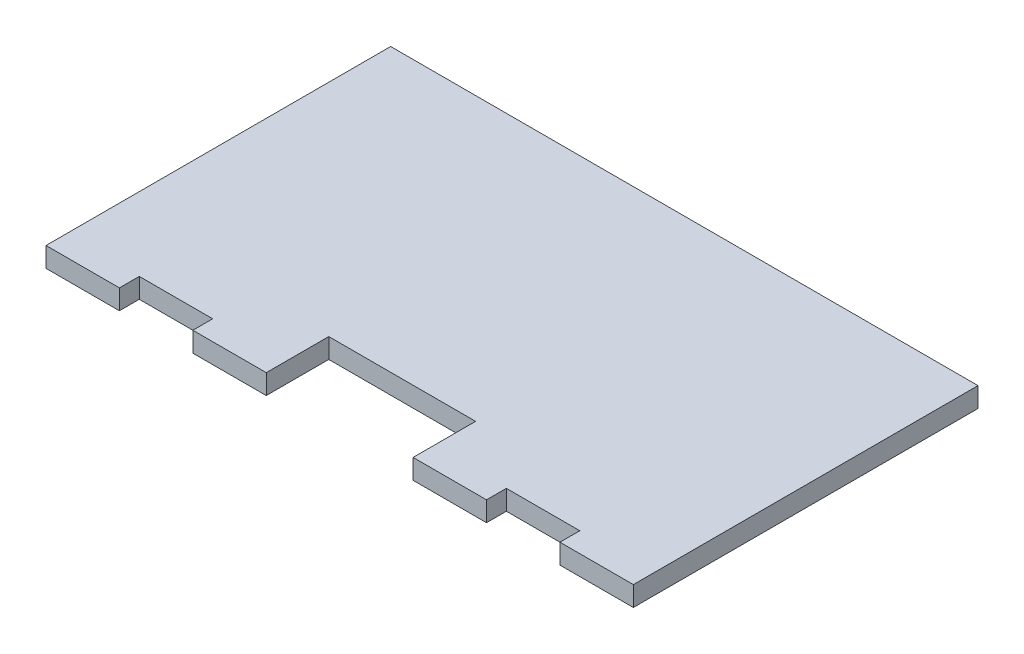
ISO-10303-21;
HEADER;
FILE_DESCRIPTION(('STEP AP214'),'2;1');
FILE_NAME('part.step','',(''),(''),'','','');
FILE_SCHEMA(('AUTOMOTIVE_DESIGN { 1 0 10303 214 1 1 1 1 }'));
ENDSEC;
DATA;
#1=APPLICATION_CONTEXT('core data for automotive mechanical design processes');
#2=APPLICATION_PROTOCOL_DEFINITION('international standard','automotive_design',2000,#1);
#3=PRODUCT_CONTEXT('',#1,'mechanical');
#4=PRODUCT('Part','Part','',(#3));
#5=PRODUCT_RELATED_PRODUCT_CATEGORY('part','',(#4));
#6=PRODUCT_DEFINITION_FORMATION('','',#4);
#7=PRODUCT_DEFINITION_CONTEXT('part definition',#1,'design');
#8=PRODUCT_DEFINITION('design','',#6,#7);
#9=PRODUCT_DEFINITION_SHAPE('','',#8);
#10=(LENGTH_UNIT() NAMED_UNIT(*) SI_UNIT(.MILLI.,.METRE.));
#11=(NAMED_UNIT(*) PLANE_ANGLE_UNIT() SI_UNIT($,.RADIAN.));
#12=(NAMED_UNIT(*) SI_UNIT($,.STERADIAN.) SOLID_ANGLE_UNIT());
#13=UNCERTAINTY_MEASURE_WITH_UNIT(LENGTH_MEASURE(1.E-05),#10,'distance_accuracy_value','');
#14=(GEOMETRIC_REPRESENTATION_CONTEXT(3) GLOBAL_UNCERTAINTY_ASSIGNED_CONTEXT((#13)) GLOBAL_UNIT_ASSIGNED_CONTEXT((#10,
#11,#12)) REPRESENTATION_CONTEXT('',''));
#15=CARTESIAN_POINT('',(0.,0.,0.));
#16=DIRECTION('',(0.,0.,1.));
#17=DIRECTION('',(1.,0.,0.));
#18=AXIS2_PLACEMENT_3D('',#15,#16,#17);
#19=CARTESIAN_POINT('',(-189.328976525822,9.7536,126.148324882629));
#20=DIRECTION('',(0.,0.,-1.));
#21=DIRECTION('',(-1.,0.,0.));
#22=AXIS2_PLACEMENT_3D('',#19,#20,#21);
#23=PLANE('',#22);
#24=DIRECTION('',(0.,-1.,0.));
#25=VECTOR('',#24,1.);
#26=CARTESIAN_POINT('',(-117.192976525822,9.7536,126.148324882629));
#27=LINE('',#26,#25);
#28=CARTESIAN_POINT('',(-117.192976525822,9.7536,126.148324882629));
#29=VERTEX_POINT('',#28);
#30=CARTESIAN_POINT('',(-117.192976525822,0.,126.148324882629));
#31=VERTEX_POINT('',#30);
#32=EDGE_CURVE('E147',#29,#31,#27,.T.);
#33=ORIENTED_EDGE('',*,*,#32,.T.);
#34=DIRECTION('',(1.,0.,0.));
#35=VECTOR('',#34,1.);
#36=CARTESIAN_POINT('',(-189.328976525822,0.,126.148324882629));
#37=LINE('',#36,#35);
#38=CARTESIAN_POINT('',(-81.1249765258216,0.,126.148324882629));
#39=VERTEX_POINT('',#38);
#40=EDGE_CURVE('E196',#31,#39,#37,.T.);
#41=ORIENTED_EDGE('',*,*,#40,.T.);
#42=DIRECTION('',(0.,-1.,0.));
#43=VECTOR('',#42,1.);
#44=CARTESIAN_POINT('',(-81.1249765258216,9.7536,126.148324882629));
#45=LINE('',#44,#43);
#46=CARTESIAN_POINT('',(-81.1249765258216,9.7536,126.148324882629));
#47=VERTEX_POINT('',#46);
#48=EDGE_CURVE('E56',#47,#39,#45,.T.);
#49=ORIENTED_EDGE('',*,*,#48,.F.);
#50=DIRECTION('',(1.,0.,0.));
#51=VECTOR('',#50,1.);
#52=CARTESIAN_POINT('',(-189.328976525822,9.7536,126.148324882629));
#53=LINE('',#52,#51);
#54=EDGE_CURVE('E166',#29,#47,#53,.T.);
#55=ORIENTED_EDGE('',*,*,#54,.F.);
#56=EDGE_LOOP('',(#33,#41,#49,#55));
#57=FACE_BOUND('',#56,.T.);
#58=ADVANCED_FACE('F33',(#57),#23,.F.);
#59=DIRECTION('',(0.,-1.,0.));
#60=VECTOR('',#59,1.);
#61=CARTESIAN_POINT('',(-8.98897652582166,9.7536,126.148324882629));
#62=LINE('',#61,#60);
#63=CARTESIAN_POINT('',(-8.98897652582166,9.7536,126.148324882629));
#64=VERTEX_POINT('',#63);
#65=CARTESIAN_POINT('',(-8.98897652582166,0.,126.148324882629));
#66=VERTEX_POINT('',#65);
#67=EDGE_CURVE('E261',#64,#66,#62,.T.);
#68=ORIENTED_EDGE('',*,*,#67,.T.);
#69=CARTESIAN_POINT('',(27.0790234741783,0.,126.148324882629));
#70=VERTEX_POINT('',#69);
#71=EDGE_CURVE('E364',#66,#70,#37,.T.);
#72=ORIENTED_EDGE('',*,*,#71,.T.);
#73=DIRECTION('',(0.,-1.,0.));
#74=VECTOR('',#73,1.);
#75=CARTESIAN_POINT('',(27.0790234741783,9.7536,126.148324882629));
#76=LINE('',#75,#74);
#77=CARTESIAN_POINT('',(27.0790234741783,9.7536,126.148324882629));
#78=VERTEX_POINT('',#77);
#79=EDGE_CURVE('E48',#78,#70,#76,.T.);
#80=ORIENTED_EDGE('',*,*,#79,.F.);
#81=EDGE_CURVE('E173',#64,#78,#53,.T.);
#82=ORIENTED_EDGE('',*,*,#81,.F.);
#83=EDGE_LOOP('',(#68,#72,#80,#82));
#84=FACE_BOUND('',#83,.T.);
#85=ADVANCED_FACE('F306',(#84),#23,.F.);
#86=DIRECTION('',(0.,-1.,0.));
#87=VECTOR('',#86,1.);
#88=CARTESIAN_POINT('',(63.1470234741783,9.7536,126.148324882629));
#89=LINE('',#88,#87);
#90=CARTESIAN_POINT('',(63.1470234741783,9.7536,126.148324882629));
#91=VERTEX_POINT('',#90);
#92=CARTESIAN_POINT('',(63.1470234741783,0.,126.148324882629));
#93=VERTEX_POINT('',#92);
#94=EDGE_CURVE('E232',#91,#93,#89,.T.);
#95=ORIENTED_EDGE('',*,*,#94,.T.);
#96=CARTESIAN_POINT('',(99.2150234741784,0.,126.148324882629));
#97=VERTEX_POINT('',#96);
#98=EDGE_CURVE('E190',#93,#97,#37,.T.);
#99=ORIENTED_EDGE('',*,*,#98,.T.);
#100=DIRECTION('',(0.,-1.,0.));
#101=VECTOR('',#100,1.);
#102=CARTESIAN_POINT('',(99.2150234741784,9.7536,126.148324882629));
#103=LINE('',#102,#101);
#104=CARTESIAN_POINT('',(99.2150234741784,9.7536,126.148324882629));
#105=VERTEX_POINT('',#104);
#106=EDGE_CURVE('E41',#105,#97,#103,.T.);
#107=ORIENTED_EDGE('',*,*,#106,.F.);
#108=EDGE_CURVE('E177',#91,#105,#53,.T.);
#109=ORIENTED_EDGE('',*,*,#108,.F.);
#110=EDGE_LOOP('',(#95,#99,#107,#109));
#111=FACE_BOUND('',#110,.T.);
#112=ADVANCED_FACE('F231',(#111),#23,.F.);
#113=CARTESIAN_POINT('',(0.,9.7536,0.));
#114=DIRECTION('',(0.,1.,0.));
#115=DIRECTION('',(0.,0.,1.));
#116=AXIS2_PLACEMENT_3D('',#113,#114,#115);
#117=PLANE('',#116);
#118=DIRECTION('',(1.,0.,0.));
#119=VECTOR('',#118,1.);
#120=CARTESIAN_POINT('',(0.,9.7536,116.394724882629));
#121=LINE('',#120,#119);
#122=CARTESIAN_POINT('',(-153.260976525822,9.7536,116.394724882629));
#123=VERTEX_POINT('',#122);
#124=CARTESIAN_POINT('',(-117.192976525822,9.7536,116.394724882629));
#125=VERTEX_POINT('',#124);
#126=EDGE_CURVE('E159',#123,#125,#121,.T.);
#127=ORIENTED_EDGE('',*,*,#126,.T.);
#128=DIRECTION('',(0.,0.,-1.));
#129=VECTOR('',#128,1.);
#130=CARTESIAN_POINT('',(-117.192976525822,9.7536,0.));
#131=LINE('',#130,#129);
#132=EDGE_CURVE('E150',#29,#125,#131,.T.);
#133=ORIENTED_EDGE('',*,*,#132,.F.);
#134=ORIENTED_EDGE('',*,*,#54,.T.);
#135=DIRECTION('',(0.,0.,-1.));
#136=VECTOR('',#135,1.);
#137=CARTESIAN_POINT('',(-81.1249765258216,9.7536,0.));
#138=LINE('',#137,#136);
#139=CARTESIAN_POINT('',(-81.1249765258216,9.7536,95.4397248826291));
#140=VERTEX_POINT('',#139);
#141=EDGE_CURVE('E267',#47,#140,#138,.T.);
#142=ORIENTED_EDGE('',*,*,#141,.T.);
#143=DIRECTION('',(-1.,0.,0.));
#144=VECTOR('',#143,1.);
#145=CARTESIAN_POINT('',(0.,9.7536,95.4397248826291));
#146=LINE('',#145,#144);
#147=CARTESIAN_POINT('',(-8.98897652582166,9.7536,95.4397248826291));
#148=VERTEX_POINT('',#147);
#149=EDGE_CURVE('E273',#148,#140,#146,.T.);
#150=ORIENTED_EDGE('',*,*,#149,.F.);
#151=DIRECTION('',(0.,0.,-1.));
#152=VECTOR('',#151,1.);
#153=CARTESIAN_POINT('',(-8.98897652582166,9.7536,0.));
#154=LINE('',#153,#152);
#155=EDGE_CURVE('E257',#64,#148,#154,.T.);
#156=ORIENTED_EDGE('',*,*,#155,.F.);
#157=ORIENTED_EDGE('',*,*,#81,.T.);
#158=DIRECTION('',(0.,0.,-1.));
#159=VECTOR('',#158,1.);
#160=CARTESIAN_POINT('',(27.0790234741783,9.7536,0.));
#161=LINE('',#160,#159);
#162=CARTESIAN_POINT('',(27.0790234741783,9.7536,116.394724882629));
#163=VERTEX_POINT('',#162);
#164=EDGE_CURVE('E237',#78,#163,#161,.T.);
#165=ORIENTED_EDGE('',*,*,#164,.T.);
#166=DIRECTION('',(-1.,0.,0.));
#167=VECTOR('',#166,1.);
#168=CARTESIAN_POINT('',(0.,9.7536,116.394724882629));
#169=LINE('',#168,#167);
#170=CARTESIAN_POINT('',(63.1470234741783,9.7536,116.394724882629));
#171=VERTEX_POINT('',#170);
#172=EDGE_CURVE('E234',#171,#163,#169,.T.);
#173=ORIENTED_EDGE('',*,*,#172,.F.);
#174=DIRECTION('',(0.,0.,-1.));
#175=VECTOR('',#174,1.);
#176=CARTESIAN_POINT('',(63.1470234741779,9.7536,-1.79695905608128E-13));
#177=LINE('',#176,#175);
#178=EDGE_CURVE('E229',#91,#171,#177,.T.);
#179=ORIENTED_EDGE('',*,*,#178,.F.);
#180=ORIENTED_EDGE('',*,*,#108,.T.);
#181=DIRECTION('',(0.,0.,-1.));
#182=VECTOR('',#181,1.);
#183=CARTESIAN_POINT('',(99.2150234741784,9.7536,-43.1680751173709));
#184=LINE('',#183,#182);
#185=CARTESIAN_POINT('',(99.2150234741784,9.7536,-43.1680751173709));
#186=VERTEX_POINT('',#185);
#187=EDGE_CURVE('E176',#105,#186,#184,.T.);
#188=ORIENTED_EDGE('',*,*,#187,.T.);
#189=DIRECTION('',(-1.,0.,0.));
#190=VECTOR('',#189,1.);
#191=CARTESIAN_POINT('',(-189.328976525822,9.7536,-43.1680751173709));
#192=LINE('',#191,#190);
#193=CARTESIAN_POINT('',(-189.328976525822,9.7536,-43.1680751173709));
#194=VERTEX_POINT('',#193);
#195=EDGE_CURVE('E184',#186,#194,#192,.T.);
#196=ORIENTED_EDGE('',*,*,#195,.T.);
#197=DIRECTION('',(0.,0.,1.));
#198=VECTOR('',#197,1.);
#199=CARTESIAN_POINT('',(-189.328976525822,9.7536,-43.1680751173709));
#200=LINE('',#199,#198);
#201=CARTESIAN_POINT('',(-189.328976525822,9.7536,126.148324882629));
#202=VERTEX_POINT('',#201);
#203=EDGE_CURVE('E181',#194,#202,#200,.T.);
#204=ORIENTED_EDGE('',*,*,#203,.T.);
#205=CARTESIAN_POINT('',(-153.260976525822,9.7536,126.148324882629));
#206=VERTEX_POINT('',#205);
#207=EDGE_CURVE('E172',#202,#206,#53,.T.);
#208=ORIENTED_EDGE('',*,*,#207,.T.);
#209=DIRECTION('',(0.,0.,-1.));
#210=VECTOR('',#209,1.);
#211=CARTESIAN_POINT('',(-153.260976525821,9.7536,-4.36130928363636E-13));
#212=LINE('',#211,#210);
#213=EDGE_CURVE('E169',#206,#123,#212,.T.);
#214=ORIENTED_EDGE('',*,*,#213,.T.);
#215=EDGE_LOOP('',(#127,#133,#134,#142,#150,#156,#157,#165,#173,#179,#180,#188,#196,#204,#208,#214));
#216=FACE_BOUND('',#215,.T.);
#217=ADVANCED_FACE('F164',(#216),#117,.T.);
#218=CARTESIAN_POINT('',(0.,0.,0.));
#219=DIRECTION('',(0.,1.,0.));
#220=DIRECTION('',(0.,0.,1.));
#221=AXIS2_PLACEMENT_3D('',#218,#219,#220);
#222=PLANE('',#221);
#223=DIRECTION('',(0.,0.,-1.));
#224=VECTOR('',#223,1.);
#225=CARTESIAN_POINT('',(-117.192976525822,0.,0.));
#226=LINE('',#225,#224);
#227=CARTESIAN_POINT('',(-117.192976525822,0.,116.394724882629));
#228=VERTEX_POINT('',#227);
#229=EDGE_CURVE('E153',#31,#228,#226,.T.);
#230=ORIENTED_EDGE('',*,*,#229,.T.);
#231=DIRECTION('',(1.,0.,0.));
#232=VECTOR('',#231,1.);
#233=CARTESIAN_POINT('',(0.,0.,116.394724882629));
#234=LINE('',#233,#232);
#235=CARTESIAN_POINT('',(-153.260976525822,0.,116.394724882629));
#236=VERTEX_POINT('',#235);
#237=EDGE_CURVE('E170',#236,#228,#234,.T.);
#238=ORIENTED_EDGE('',*,*,#237,.F.);
#239=DIRECTION('',(0.,0.,-1.));
#240=VECTOR('',#239,1.);
#241=CARTESIAN_POINT('',(-153.260976525821,0.,-4.36130928363636E-13));
#242=LINE('',#241,#240);
#243=CARTESIAN_POINT('',(-153.260976525822,0.,126.148324882629));
#244=VERTEX_POINT('',#243);
#245=EDGE_CURVE('E282',#244,#236,#242,.T.);
#246=ORIENTED_EDGE('',*,*,#245,.F.);
#247=CARTESIAN_POINT('',(-189.328976525822,0.,126.148324882629));
#248=VERTEX_POINT('',#247);
#249=EDGE_CURVE('E192',#248,#244,#37,.T.);
#250=ORIENTED_EDGE('',*,*,#249,.F.);
#251=DIRECTION('',(0.,0.,1.));
#252=VECTOR('',#251,1.);
#253=CARTESIAN_POINT('',(-189.328976525822,0.,-43.1680751173709));
#254=LINE('',#253,#252);
#255=CARTESIAN_POINT('',(-189.328976525822,0.,-43.1680751173709));
#256=VERTEX_POINT('',#255);
#257=EDGE_CURVE('E187',#256,#248,#254,.T.);
#258=ORIENTED_EDGE('',*,*,#257,.F.);
#259=DIRECTION('',(-1.,0.,0.));
#260=VECTOR('',#259,1.);
#261=CARTESIAN_POINT('',(-189.328976525822,0.,-43.1680751173709));
#262=LINE('',#261,#260);
#263=CARTESIAN_POINT('',(99.2150234741784,0.,-43.1680751173709));
#264=VERTEX_POINT('',#263);
#265=EDGE_CURVE('E198',#264,#256,#262,.T.);
#266=ORIENTED_EDGE('',*,*,#265,.F.);
#267=DIRECTION('',(0.,0.,-1.));
#268=VECTOR('',#267,1.);
#269=CARTESIAN_POINT('',(99.2150234741784,0.,-43.1680751173709));
#270=LINE('',#269,#268);
#271=EDGE_CURVE('E195',#97,#264,#270,.T.);
#272=ORIENTED_EDGE('',*,*,#271,.F.);
#273=ORIENTED_EDGE('',*,*,#98,.F.);
#274=DIRECTION('',(0.,0.,-1.));
#275=VECTOR('',#274,1.);
#276=CARTESIAN_POINT('',(63.1470234741779,0.,-1.79695905608128E-13));
#277=LINE('',#276,#275);
#278=CARTESIAN_POINT('',(63.1470234741783,0.,116.394724882629));
#279=VERTEX_POINT('',#278);
#280=EDGE_CURVE('E250',#93,#279,#277,.T.);
#281=ORIENTED_EDGE('',*,*,#280,.T.);
#282=DIRECTION('',(-1.,0.,0.));
#283=VECTOR('',#282,1.);
#284=CARTESIAN_POINT('',(0.,0.,116.394724882629));
#285=LINE('',#284,#283);
#286=CARTESIAN_POINT('',(27.0790234741783,0.,116.394724882629));
#287=VERTEX_POINT('',#286);
#288=EDGE_CURVE('E245',#279,#287,#285,.T.);
#289=ORIENTED_EDGE('',*,*,#288,.T.);
#290=DIRECTION('',(0.,0.,-1.));
#291=VECTOR('',#290,1.);
#292=CARTESIAN_POINT('',(27.0790234741783,0.,0.));
#293=LINE('',#292,#291);
#294=EDGE_CURVE('E248',#70,#287,#293,.T.);
#295=ORIENTED_EDGE('',*,*,#294,.F.);
#296=ORIENTED_EDGE('',*,*,#71,.F.);
#297=DIRECTION('',(0.,0.,-1.));
#298=VECTOR('',#297,1.);
#299=CARTESIAN_POINT('',(-8.98897652582166,0.,0.));
#300=LINE('',#299,#298);
#301=CARTESIAN_POINT('',(-8.98897652582166,0.,95.4397248826291));
#302=VERTEX_POINT('',#301);
#303=EDGE_CURVE('E264',#66,#302,#300,.T.);
#304=ORIENTED_EDGE('',*,*,#303,.T.);
#305=DIRECTION('',(-1.,0.,0.));
#306=VECTOR('',#305,1.);
#307=CARTESIAN_POINT('',(0.,0.,95.4397248826291));
#308=LINE('',#307,#306);
#309=CARTESIAN_POINT('',(-81.1249765258216,0.,95.4397248826291));
#310=VERTEX_POINT('',#309);
#311=EDGE_CURVE('E268',#302,#310,#308,.T.);
#312=ORIENTED_EDGE('',*,*,#311,.T.);
#313=DIRECTION('',(0.,0.,-1.));
#314=VECTOR('',#313,1.);
#315=CARTESIAN_POINT('',(-81.1249765258216,0.,0.));
#316=LINE('',#315,#314);
#317=EDGE_CURVE('E244',#39,#310,#316,.T.);
#318=ORIENTED_EDGE('',*,*,#317,.F.);
#319=ORIENTED_EDGE('',*,*,#40,.F.);
#320=EDGE_LOOP('',(#230,#238,#246,#250,#258,#266,#272,#273,#281,#289,#295,#296,#304,#312,#318,#319));
#321=FACE_BOUND('',#320,.T.);
#322=ADVANCED_FACE('F216',(#321),#222,.F.);
#323=CARTESIAN_POINT('',(-189.328976525822,9.7536,-43.1680751173709));
#324=DIRECTION('',(1.,0.,0.));
#325=DIRECTION('',(0.,0.,-1.));
#326=AXIS2_PLACEMENT_3D('',#323,#324,#325);
#327=PLANE('',#326);
#328=ORIENTED_EDGE('',*,*,#257,.T.);
#329=DIRECTION('',(0.,-1.,0.));
#330=VECTOR('',#329,1.);
#331=CARTESIAN_POINT('',(-189.328976525822,9.7536,126.148324882629));
#332=LINE('',#331,#330);
#333=EDGE_CURVE('E11',#202,#248,#332,.T.);
#334=ORIENTED_EDGE('',*,*,#333,.F.);
#335=ORIENTED_EDGE('',*,*,#203,.F.);
#336=DIRECTION('',(0.,-1.,0.));
#337=VECTOR('',#336,1.);
#338=CARTESIAN_POINT('',(-189.328976525822,9.7536,-43.1680751173709));
#339=LINE('',#338,#337);
#340=EDGE_CURVE('E186',#194,#256,#339,.T.);
#341=ORIENTED_EDGE('',*,*,#340,.T.);
#342=EDGE_LOOP('',(#328,#334,#335,#341));
#343=FACE_BOUND('',#342,.T.);
#344=ADVANCED_FACE('F35',(#343),#327,.F.);
#345=ORIENTED_EDGE('',*,*,#249,.T.);
#346=DIRECTION('',(0.,-1.,0.));
#347=VECTOR('',#346,1.);
#348=CARTESIAN_POINT('',(-153.260976525822,9.7536,126.148324882629));
#349=LINE('',#348,#347);
#350=EDGE_CURVE('E158',#206,#244,#349,.T.);
#351=ORIENTED_EDGE('',*,*,#350,.F.);
#352=ORIENTED_EDGE('',*,*,#207,.F.);
#353=ORIENTED_EDGE('',*,*,#333,.T.);
#354=EDGE_LOOP('',(#345,#351,#352,#353));
#355=FACE_BOUND('',#354,.T.);
#356=ADVANCED_FACE('F292',(#355),#23,.F.);
#357=CARTESIAN_POINT('',(99.2150234741784,9.7536,-43.1680751173709));
#358=DIRECTION('',(-1.,0.,0.));
#359=DIRECTION('',(0.,0.,1.));
#360=AXIS2_PLACEMENT_3D('',#357,#358,#359);
#361=PLANE('',#360);
#362=ORIENTED_EDGE('',*,*,#271,.T.);
#363=DIRECTION('',(0.,-1.,0.));
#364=VECTOR('',#363,1.);
#365=CARTESIAN_POINT('',(99.2150234741784,9.7536,-43.1680751173709));
#366=LINE('',#365,#364);
#367=EDGE_CURVE('E202',#186,#264,#366,.T.);
#368=ORIENTED_EDGE('',*,*,#367,.F.);
#369=ORIENTED_EDGE('',*,*,#187,.F.);
#370=ORIENTED_EDGE('',*,*,#106,.T.);
#371=EDGE_LOOP('',(#362,#368,#369,#370));
#372=FACE_BOUND('',#371,.T.);
#373=ADVANCED_FACE('F209',(#372),#361,.F.);
#374=CARTESIAN_POINT('',(-189.328976525822,9.7536,-43.1680751173709));
#375=DIRECTION('',(0.,0.,1.));
#376=DIRECTION('',(1.,0.,0.));
#377=AXIS2_PLACEMENT_3D('',#374,#375,#376);
#378=PLANE('',#377);
#379=ORIENTED_EDGE('',*,*,#265,.T.);
#380=ORIENTED_EDGE('',*,*,#340,.F.);
#381=ORIENTED_EDGE('',*,*,#195,.F.);
#382=ORIENTED_EDGE('',*,*,#367,.T.);
#383=EDGE_LOOP('',(#379,#380,#381,#382));
#384=FACE_BOUND('',#383,.T.);
#385=ADVANCED_FACE('F221',(#384),#378,.F.);
#386=CARTESIAN_POINT('',(63.1470234741779,9.7536,-1.79695905608128E-13));
#387=DIRECTION('',(-1.,0.,0.));
#388=DIRECTION('',(0.,0.,1.));
#389=AXIS2_PLACEMENT_3D('',#386,#387,#388);
#390=PLANE('',#389);
#391=ORIENTED_EDGE('',*,*,#280,.F.);
#392=ORIENTED_EDGE('',*,*,#94,.F.);
#393=ORIENTED_EDGE('',*,*,#178,.T.);
#394=DIRECTION('',(0.,-1.,0.));
#395=VECTOR('',#394,1.);
#396=CARTESIAN_POINT('',(63.1470234741783,9.7536,116.394724882629));
#397=LINE('',#396,#395);
#398=EDGE_CURVE('E241',#171,#279,#397,.T.);
#399=ORIENTED_EDGE('',*,*,#398,.T.);
#400=EDGE_LOOP('',(#391,#392,#393,#399));
#401=FACE_BOUND('',#400,.T.);
#402=ADVANCED_FACE('F327',(#401),#390,.T.);
#403=CARTESIAN_POINT('',(0.,9.7536,116.394724882629));
#404=DIRECTION('',(0.,0.,1.));
#405=DIRECTION('',(1.,0.,0.));
#406=AXIS2_PLACEMENT_3D('',#403,#404,#405);
#407=PLANE('',#406);
#408=ORIENTED_EDGE('',*,*,#288,.F.);
#409=ORIENTED_EDGE('',*,*,#398,.F.);
#410=ORIENTED_EDGE('',*,*,#172,.T.);
#411=DIRECTION('',(0.,-1.,0.));
#412=VECTOR('',#411,1.);
#413=CARTESIAN_POINT('',(27.0790234741783,9.7536,116.394724882629));
#414=LINE('',#413,#412);
#415=EDGE_CURVE('E235',#163,#287,#414,.T.);
#416=ORIENTED_EDGE('',*,*,#415,.T.);
#417=EDGE_LOOP('',(#408,#409,#410,#416));
#418=FACE_BOUND('',#417,.T.);
#419=ADVANCED_FACE('F334',(#418),#407,.T.);
#420=CARTESIAN_POINT('',(27.0790234741783,9.7536,0.));
#421=DIRECTION('',(-1.,0.,0.));
#422=DIRECTION('',(0.,0.,1.));
#423=AXIS2_PLACEMENT_3D('',#420,#421,#422);
#424=PLANE('',#423);
#425=ORIENTED_EDGE('',*,*,#294,.T.);
#426=ORIENTED_EDGE('',*,*,#415,.F.);
#427=ORIENTED_EDGE('',*,*,#164,.F.);
#428=ORIENTED_EDGE('',*,*,#79,.T.);
#429=EDGE_LOOP('',(#425,#426,#427,#428));
#430=FACE_BOUND('',#429,.T.);
#431=ADVANCED_FACE('F338',(#430),#424,.F.);
#432=CARTESIAN_POINT('',(-8.98897652582166,9.7536,0.));
#433=DIRECTION('',(-1.,0.,0.));
#434=DIRECTION('',(0.,0.,1.));
#435=AXIS2_PLACEMENT_3D('',#432,#433,#434);
#436=PLANE('',#435);
#437=ORIENTED_EDGE('',*,*,#303,.F.);
#438=ORIENTED_EDGE('',*,*,#67,.F.);
#439=ORIENTED_EDGE('',*,*,#155,.T.);
#440=DIRECTION('',(0.,-1.,0.));
#441=VECTOR('',#440,1.);
#442=CARTESIAN_POINT('',(-8.98897652582166,9.7536,95.4397248826291));
#443=LINE('',#442,#441);
#444=EDGE_CURVE('E259',#148,#302,#443,.T.);
#445=ORIENTED_EDGE('',*,*,#444,.T.);
#446=EDGE_LOOP('',(#437,#438,#439,#445));
#447=FACE_BOUND('',#446,.T.);
#448=ADVANCED_FACE('F346',(#447),#436,.T.);
#449=CARTESIAN_POINT('',(0.,9.7536,95.4397248826291));
#450=DIRECTION('',(0.,0.,1.));
#451=DIRECTION('',(1.,0.,0.));
#452=AXIS2_PLACEMENT_3D('',#449,#450,#451);
#453=PLANE('',#452);
#454=ORIENTED_EDGE('',*,*,#311,.F.);
#455=ORIENTED_EDGE('',*,*,#444,.F.);
#456=ORIENTED_EDGE('',*,*,#149,.T.);
#457=DIRECTION('',(0.,-1.,0.));
#458=VECTOR('',#457,1.);
#459=CARTESIAN_POINT('',(-81.1249765258216,9.7536,95.4397248826291));
#460=LINE('',#459,#458);
#461=EDGE_CURVE('E256',#140,#310,#460,.T.);
#462=ORIENTED_EDGE('',*,*,#461,.T.);
#463=EDGE_LOOP('',(#454,#455,#456,#462));
#464=FACE_BOUND('',#463,.T.);
#465=ADVANCED_FACE('F350',(#464),#453,.T.);
#466=CARTESIAN_POINT('',(-81.1249765258216,9.7536,0.));
#467=DIRECTION('',(-1.,0.,0.));
#468=DIRECTION('',(0.,0.,1.));
#469=AXIS2_PLACEMENT_3D('',#466,#467,#468);
#470=PLANE('',#469);
#471=ORIENTED_EDGE('',*,*,#317,.T.);
#472=ORIENTED_EDGE('',*,*,#461,.F.);
#473=ORIENTED_EDGE('',*,*,#141,.F.);
#474=ORIENTED_EDGE('',*,*,#48,.T.);
#475=EDGE_LOOP('',(#471,#472,#473,#474));
#476=FACE_BOUND('',#475,.T.);
#477=ADVANCED_FACE('F303',(#476),#470,.F.);
#478=CARTESIAN_POINT('',(-117.192976525822,9.7536,0.));
#479=DIRECTION('',(-1.,0.,0.));
#480=DIRECTION('',(0.,0.,1.));
#481=AXIS2_PLACEMENT_3D('',#478,#479,#480);
#482=PLANE('',#481);
#483=ORIENTED_EDGE('',*,*,#229,.F.);
#484=ORIENTED_EDGE('',*,*,#32,.F.);
#485=ORIENTED_EDGE('',*,*,#132,.T.);
#486=DIRECTION('',(0.,-1.,0.));
#487=VECTOR('',#486,1.);
#488=CARTESIAN_POINT('',(-117.192976525822,9.7536,116.394724882629));
#489=LINE('',#488,#487);
#490=EDGE_CURVE('E191',#125,#228,#489,.T.);
#491=ORIENTED_EDGE('',*,*,#490,.T.);
#492=EDGE_LOOP('',(#483,#484,#485,#491));
#493=FACE_BOUND('',#492,.T.);
#494=ADVANCED_FACE('F149',(#493),#482,.T.);
#495=CARTESIAN_POINT('',(0.,9.7536,116.394724882629));
#496=DIRECTION('',(0.,0.,-1.));
#497=DIRECTION('',(-1.,0.,0.));
#498=AXIS2_PLACEMENT_3D('',#495,#496,#497);
#499=PLANE('',#498);
#500=ORIENTED_EDGE('',*,*,#237,.T.);
#501=ORIENTED_EDGE('',*,*,#490,.F.);
#502=ORIENTED_EDGE('',*,*,#126,.F.);
#503=DIRECTION('',(0.,-1.,0.));
#504=VECTOR('',#503,1.);
#505=CARTESIAN_POINT('',(-153.260976525822,9.7536,116.394724882629));
#506=LINE('',#505,#504);
#507=EDGE_CURVE('E277',#123,#236,#506,.T.);
#508=ORIENTED_EDGE('',*,*,#507,.T.);
#509=EDGE_LOOP('',(#500,#501,#502,#508));
#510=FACE_BOUND('',#509,.T.);
#511=ADVANCED_FACE('F295',(#510),#499,.F.);
#512=CARTESIAN_POINT('',(-153.260976525821,9.7536,-4.36130928363636E-13));
#513=DIRECTION('',(-1.,0.,0.));
#514=DIRECTION('',(0.,0.,1.));
#515=AXIS2_PLACEMENT_3D('',#512,#513,#514);
#516=PLANE('',#515);
#517=ORIENTED_EDGE('',*,*,#245,.T.);
#518=ORIENTED_EDGE('',*,*,#507,.F.);
#519=ORIENTED_EDGE('',*,*,#213,.F.);
#520=ORIENTED_EDGE('',*,*,#350,.T.);
#521=EDGE_LOOP('',(#517,#518,#519,#520));
#522=FACE_BOUND('',#521,.T.);
#523=ADVANCED_FACE('F289',(#522),#516,.F.);
#524=CLOSED_SHELL('',(#58,#85,#112,#217,#322,#344,#356,#373,#385,#402,#419,#431,#448,#465,#477,
#494,#511,#523));
#525=MANIFOLD_SOLID_BREP('B2',#524);
#526=ADVANCED_BREP_SHAPE_REPRESENTATION('',(#18,#525),#14);
#527=SHAPE_DEFINITION_REPRESENTATION(#9,#526);
ENDSEC;
END-ISO-10303-21;
